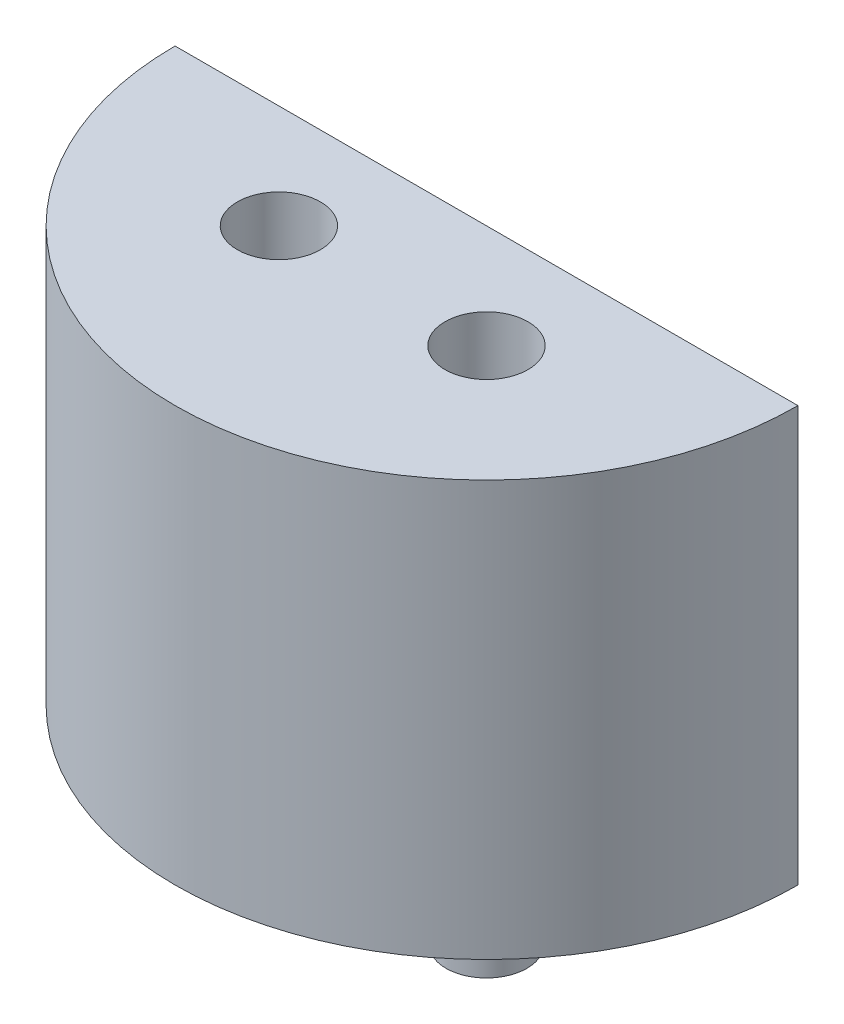
ISO-10303-21;
HEADER;
FILE_DESCRIPTION(('STEP AP214'),'2;1');
FILE_NAME('part.step','',(''),(''),'','','');
FILE_SCHEMA(('AUTOMOTIVE_DESIGN { 1 0 10303 214 1 1 1 1 }'));
ENDSEC;
DATA;
#1=APPLICATION_CONTEXT('core data for automotive mechanical design processes');
#2=APPLICATION_PROTOCOL_DEFINITION('international standard','automotive_design',2000,#1);
#3=PRODUCT_CONTEXT('',#1,'mechanical');
#4=PRODUCT('Part','Part','',(#3));
#5=PRODUCT_RELATED_PRODUCT_CATEGORY('part','',(#4));
#6=PRODUCT_DEFINITION_FORMATION('','',#4);
#7=PRODUCT_DEFINITION_CONTEXT('part definition',#1,'design');
#8=PRODUCT_DEFINITION('design','',#6,#7);
#9=PRODUCT_DEFINITION_SHAPE('','',#8);
#10=(LENGTH_UNIT() NAMED_UNIT(*) SI_UNIT(.MILLI.,.METRE.));
#11=(NAMED_UNIT(*) PLANE_ANGLE_UNIT() SI_UNIT($,.RADIAN.));
#12=(NAMED_UNIT(*) SI_UNIT($,.STERADIAN.) SOLID_ANGLE_UNIT());
#13=UNCERTAINTY_MEASURE_WITH_UNIT(LENGTH_MEASURE(1.E-05),#10,'distance_accuracy_value','');
#14=(GEOMETRIC_REPRESENTATION_CONTEXT(3) GLOBAL_UNCERTAINTY_ASSIGNED_CONTEXT((#13)) GLOBAL_UNIT_ASSIGNED_CONTEXT((#10,
#11,#12)) REPRESENTATION_CONTEXT('',''));
#15=CARTESIAN_POINT('',(0.,0.,0.));
#16=DIRECTION('',(0.,0.,1.));
#17=DIRECTION('',(1.,0.,0.));
#18=AXIS2_PLACEMENT_3D('',#15,#16,#17);
#19=CARTESIAN_POINT('',(0.,20.,0.));
#20=DIRECTION('',(0.,-1.,0.));
#21=DIRECTION('',(0.,0.,-1.));
#22=AXIS2_PLACEMENT_3D('',#19,#20,#21);
#23=CYLINDRICAL_SURFACE('',#22,15.);
#24=CARTESIAN_POINT('',(0.,0.,0.));
#25=DIRECTION('',(0.,1.,0.));
#26=DIRECTION('',(0.,0.,1.));
#27=AXIS2_PLACEMENT_3D('',#24,#25,#26);
#28=CIRCLE('',#27,15.);
#29=CARTESIAN_POINT('',(-15.,0.,0.));
#30=VERTEX_POINT('',#29);
#31=CARTESIAN_POINT('',(15.,0.,0.));
#32=VERTEX_POINT('',#31);
#33=EDGE_CURVE('E81',#30,#32,#28,.T.);
#34=ORIENTED_EDGE('',*,*,#33,.T.);
#35=DIRECTION('',(0.,-1.,0.));
#36=VECTOR('',#35,1.);
#37=CARTESIAN_POINT('',(15.,20.,0.));
#38=LINE('',#37,#36);
#39=CARTESIAN_POINT('',(15.,20.,0.));
#40=VERTEX_POINT('',#39);
#41=EDGE_CURVE('E77',#40,#32,#38,.T.);
#42=ORIENTED_EDGE('',*,*,#41,.F.);
#43=CARTESIAN_POINT('',(0.,20.,0.));
#44=DIRECTION('',(0.,1.,0.));
#45=DIRECTION('',(0.,0.,1.));
#46=AXIS2_PLACEMENT_3D('',#43,#44,#45);
#47=CIRCLE('',#46,15.);
#48=CARTESIAN_POINT('',(-15.,20.,0.));
#49=VERTEX_POINT('',#48);
#50=EDGE_CURVE('E80',#49,#40,#47,.T.);
#51=ORIENTED_EDGE('',*,*,#50,.F.);
#52=DIRECTION('',(0.,-1.,0.));
#53=VECTOR('',#52,1.);
#54=CARTESIAN_POINT('',(-15.,20.,0.));
#55=LINE('',#54,#53);
#56=EDGE_CURVE('E74',#49,#30,#55,.T.);
#57=ORIENTED_EDGE('',*,*,#56,.T.);
#58=EDGE_LOOP('',(#34,#42,#51,#57));
#59=FACE_BOUND('',#58,.T.);
#60=ADVANCED_FACE('F45',(#59),#23,.T.);
#61=CARTESIAN_POINT('',(-15.,20.,0.));
#62=DIRECTION('',(0.,0.,1.));
#63=DIRECTION('',(1.,0.,0.));
#64=AXIS2_PLACEMENT_3D('',#61,#62,#63);
#65=PLANE('',#64);
#66=DIRECTION('',(-1.,0.,0.));
#67=VECTOR('',#66,1.);
#68=CARTESIAN_POINT('',(-15.,0.,0.));
#69=LINE('',#68,#67);
#70=EDGE_CURVE('E69',#32,#30,#69,.T.);
#71=ORIENTED_EDGE('',*,*,#70,.T.);
#72=ORIENTED_EDGE('',*,*,#56,.F.);
#73=DIRECTION('',(-1.,0.,0.));
#74=VECTOR('',#73,1.);
#75=CARTESIAN_POINT('',(-15.,20.,0.));
#76=LINE('',#75,#74);
#77=EDGE_CURVE('E61',#40,#49,#76,.T.);
#78=ORIENTED_EDGE('',*,*,#77,.F.);
#79=ORIENTED_EDGE('',*,*,#41,.T.);
#80=EDGE_LOOP('',(#71,#72,#78,#79));
#81=FACE_BOUND('',#80,.T.);
#82=ADVANCED_FACE('F73',(#81),#65,.F.);
#83=CARTESIAN_POINT('',(0.,20.,0.));
#84=DIRECTION('',(0.,1.,0.));
#85=DIRECTION('',(0.,0.,1.));
#86=AXIS2_PLACEMENT_3D('',#83,#84,#85);
#87=PLANE('',#86);
#88=CARTESIAN_POINT('',(-5.,20.,5.));
#89=DIRECTION('',(0.,1.,0.));
#90=DIRECTION('',(0.,0.,1.));
#91=AXIS2_PLACEMENT_3D('',#88,#89,#90);
#92=CIRCLE('',#91,2.);
#93=CARTESIAN_POINT('',(-5.,20.,7.));
#94=VERTEX_POINT('',#93);
#95=EDGE_CURVE('E93',#94,#94,#92,.T.);
#96=ORIENTED_EDGE('',*,*,#95,.F.);
#97=EDGE_LOOP('',(#96));
#98=FACE_BOUND('',#97,.T.);
#99=CARTESIAN_POINT('',(5.,20.,5.));
#100=DIRECTION('',(0.,1.,0.));
#101=DIRECTION('',(0.,0.,-1.));
#102=AXIS2_PLACEMENT_3D('',#99,#100,#101);
#103=CIRCLE('',#102,2.);
#104=CARTESIAN_POINT('',(5.,20.,3.));
#105=VERTEX_POINT('',#104);
#106=EDGE_CURVE('E239',#105,#105,#103,.T.);
#107=ORIENTED_EDGE('',*,*,#106,.F.);
#108=EDGE_LOOP('',(#107));
#109=FACE_BOUND('',#108,.T.);
#110=ORIENTED_EDGE('',*,*,#50,.T.);
#111=ORIENTED_EDGE('',*,*,#77,.T.);
#112=EDGE_LOOP('',(#110,#111));
#113=FACE_BOUND('',#112,.T.);
#114=ADVANCED_FACE('F106',(#98,#109,#113),#87,.T.);
#115=CARTESIAN_POINT('',(0.,0.,0.));
#116=DIRECTION('',(0.,1.,0.));
#117=DIRECTION('',(0.,0.,1.));
#118=AXIS2_PLACEMENT_3D('',#115,#116,#117);
#119=PLANE('',#118);
#120=CARTESIAN_POINT('',(5.,0.,5.));
#121=DIRECTION('',(0.,1.,0.));
#122=DIRECTION('',(0.,0.,1.));
#123=AXIS2_PLACEMENT_3D('',#120,#121,#122);
#124=CIRCLE('',#123,1.95);
#125=CARTESIAN_POINT('',(5.,0.,6.95));
#126=VERTEX_POINT('',#125);
#127=EDGE_CURVE('E11',#126,#126,#124,.F.);
#128=ORIENTED_EDGE('',*,*,#127,.F.);
#129=EDGE_LOOP('',(#128));
#130=FACE_BOUND('',#129,.T.);
#131=CARTESIAN_POINT('',(-5.,0.,5.));
#132=DIRECTION('',(0.,1.,0.));
#133=DIRECTION('',(0.,0.,1.));
#134=AXIS2_PLACEMENT_3D('',#131,#132,#133);
#135=CIRCLE('',#134,1.95);
#136=CARTESIAN_POINT('',(-5.,0.,6.95));
#137=VERTEX_POINT('',#136);
#138=EDGE_CURVE('E54',#137,#137,#135,.F.);
#139=ORIENTED_EDGE('',*,*,#138,.F.);
#140=EDGE_LOOP('',(#139));
#141=FACE_BOUND('',#140,.T.);
#142=ORIENTED_EDGE('',*,*,#33,.F.);
#143=ORIENTED_EDGE('',*,*,#70,.F.);
#144=EDGE_LOOP('',(#142,#143));
#145=FACE_BOUND('',#144,.T.);
#146=ADVANCED_FACE('F86',(#130,#141,#145),#119,.F.);
#147=CARTESIAN_POINT('',(5.,14.,5.));
#148=DIRECTION('',(0.,1.,0.));
#149=DIRECTION('',(0.,0.,1.));
#150=AXIS2_PLACEMENT_3D('',#147,#148,#149);
#151=CYLINDRICAL_SURFACE('',#150,2.);
#152=CARTESIAN_POINT('',(5.,14.,5.));
#153=DIRECTION('',(0.,1.,0.));
#154=DIRECTION('',(0.,0.,-1.));
#155=AXIS2_PLACEMENT_3D('',#152,#153,#154);
#156=CIRCLE('',#155,2.);
#157=CARTESIAN_POINT('',(5.,14.,3.));
#158=VERTEX_POINT('',#157);
#159=EDGE_CURVE('E233',#158,#158,#156,.T.);
#160=ORIENTED_EDGE('',*,*,#159,.F.);
#161=EDGE_LOOP('',(#160));
#162=FACE_BOUND('',#161,.T.);
#163=ORIENTED_EDGE('',*,*,#106,.T.);
#164=EDGE_LOOP('',(#163));
#165=FACE_BOUND('',#164,.T.);
#166=ADVANCED_FACE('F105',(#162,#165),#151,.F.);
#167=CARTESIAN_POINT('',(5.,14.,5.));
#168=DIRECTION('',(0.,-1.,0.));
#169=DIRECTION('',(0.,0.,-1.));
#170=AXIS2_PLACEMENT_3D('',#167,#168,#169);
#171=PLANE('',#170);
#172=ORIENTED_EDGE('',*,*,#159,.T.);
#173=EDGE_LOOP('',(#172));
#174=FACE_BOUND('',#173,.T.);
#175=ADVANCED_FACE('F112',(#174),#171,.F.);
#176=CARTESIAN_POINT('',(-5.,14.,5.));
#177=DIRECTION('',(0.,1.,0.));
#178=DIRECTION('',(0.,0.,1.));
#179=AXIS2_PLACEMENT_3D('',#176,#177,#178);
#180=CYLINDRICAL_SURFACE('',#179,2.);
#181=CARTESIAN_POINT('',(-5.,14.,5.));
#182=DIRECTION('',(0.,1.,0.));
#183=DIRECTION('',(0.,0.,1.));
#184=AXIS2_PLACEMENT_3D('',#181,#182,#183);
#185=CIRCLE('',#184,2.);
#186=CARTESIAN_POINT('',(-5.,14.,7.));
#187=VERTEX_POINT('',#186);
#188=EDGE_CURVE('E88',#187,#187,#185,.T.);
#189=ORIENTED_EDGE('',*,*,#188,.F.);
#190=EDGE_LOOP('',(#189));
#191=FACE_BOUND('',#190,.T.);
#192=ORIENTED_EDGE('',*,*,#95,.T.);
#193=EDGE_LOOP('',(#192));
#194=FACE_BOUND('',#193,.T.);
#195=ADVANCED_FACE('F142',(#191,#194),#180,.F.);
#196=CARTESIAN_POINT('',(-5.,14.,5.));
#197=DIRECTION('',(0.,1.,0.));
#198=DIRECTION('',(0.,0.,1.));
#199=AXIS2_PLACEMENT_3D('',#196,#197,#198);
#200=PLANE('',#199);
#201=ORIENTED_EDGE('',*,*,#188,.T.);
#202=EDGE_LOOP('',(#201));
#203=FACE_BOUND('',#202,.T.);
#204=ADVANCED_FACE('F152',(#203),#200,.T.);
#205=CARTESIAN_POINT('',(-5.,-5.,5.));
#206=DIRECTION('',(0.,1.,0.));
#207=DIRECTION('',(0.,0.,1.));
#208=AXIS2_PLACEMENT_3D('',#205,#206,#207);
#209=CYLINDRICAL_SURFACE('',#208,1.95);
#210=CARTESIAN_POINT('',(-5.,-5.,5.));
#211=DIRECTION('',(0.,-1.,0.));
#212=DIRECTION('',(0.,0.,-1.));
#213=AXIS2_PLACEMENT_3D('',#210,#211,#212);
#214=CIRCLE('',#213,1.95);
#215=CARTESIAN_POINT('',(-5.,-5.,3.05));
#216=VERTEX_POINT('',#215);
#217=EDGE_CURVE('E234',#216,#216,#214,.T.);
#218=ORIENTED_EDGE('',*,*,#217,.F.);
#219=EDGE_LOOP('',(#218));
#220=FACE_BOUND('',#219,.T.);
#221=ORIENTED_EDGE('',*,*,#138,.T.);
#222=EDGE_LOOP('',(#221));
#223=FACE_BOUND('',#222,.T.);
#224=ADVANCED_FACE('F102',(#220,#223),#209,.T.);
#225=CARTESIAN_POINT('',(-5.,-5.,5.));
#226=DIRECTION('',(0.,-1.,0.));
#227=DIRECTION('',(0.,0.,-1.));
#228=AXIS2_PLACEMENT_3D('',#225,#226,#227);
#229=PLANE('',#228);
#230=ORIENTED_EDGE('',*,*,#217,.T.);
#231=EDGE_LOOP('',(#230));
#232=FACE_BOUND('',#231,.T.);
#233=ADVANCED_FACE('F175',(#232),#229,.T.);
#234=CARTESIAN_POINT('',(5.,-5.,5.));
#235=DIRECTION('',(0.,1.,0.));
#236=DIRECTION('',(0.,0.,1.));
#237=AXIS2_PLACEMENT_3D('',#234,#235,#236);
#238=CYLINDRICAL_SURFACE('',#237,1.95);
#239=CARTESIAN_POINT('',(5.,-5.,5.));
#240=DIRECTION('',(0.,-1.,0.));
#241=DIRECTION('',(0.,0.,-1.));
#242=AXIS2_PLACEMENT_3D('',#239,#240,#241);
#243=CIRCLE('',#242,1.95);
#244=CARTESIAN_POINT('',(5.,-5.,3.05));
#245=VERTEX_POINT('',#244);
#246=EDGE_CURVE('E231',#245,#245,#243,.T.);
#247=ORIENTED_EDGE('',*,*,#246,.F.);
#248=EDGE_LOOP('',(#247));
#249=FACE_BOUND('',#248,.T.);
#250=ORIENTED_EDGE('',*,*,#127,.T.);
#251=EDGE_LOOP('',(#250));
#252=FACE_BOUND('',#251,.T.);
#253=ADVANCED_FACE('F185',(#249,#252),#238,.T.);
#254=CARTESIAN_POINT('',(5.,-5.,5.));
#255=DIRECTION('',(0.,-1.,0.));
#256=DIRECTION('',(0.,0.,-1.));
#257=AXIS2_PLACEMENT_3D('',#254,#255,#256);
#258=PLANE('',#257);
#259=ORIENTED_EDGE('',*,*,#246,.T.);
#260=EDGE_LOOP('',(#259));
#261=FACE_BOUND('',#260,.T.);
#262=ADVANCED_FACE('F195',(#261),#258,.T.);
#263=CLOSED_SHELL('',(#60,#82,#114,#146,#166,#175,#195,#204,#224,#233,#253,#262));
#264=MANIFOLD_SOLID_BREP('B2',#263);
#265=ADVANCED_BREP_SHAPE_REPRESENTATION('',(#18,#264),#14);
#266=SHAPE_DEFINITION_REPRESENTATION(#9,#265);
ENDSEC;
END-ISO-10303-21;
